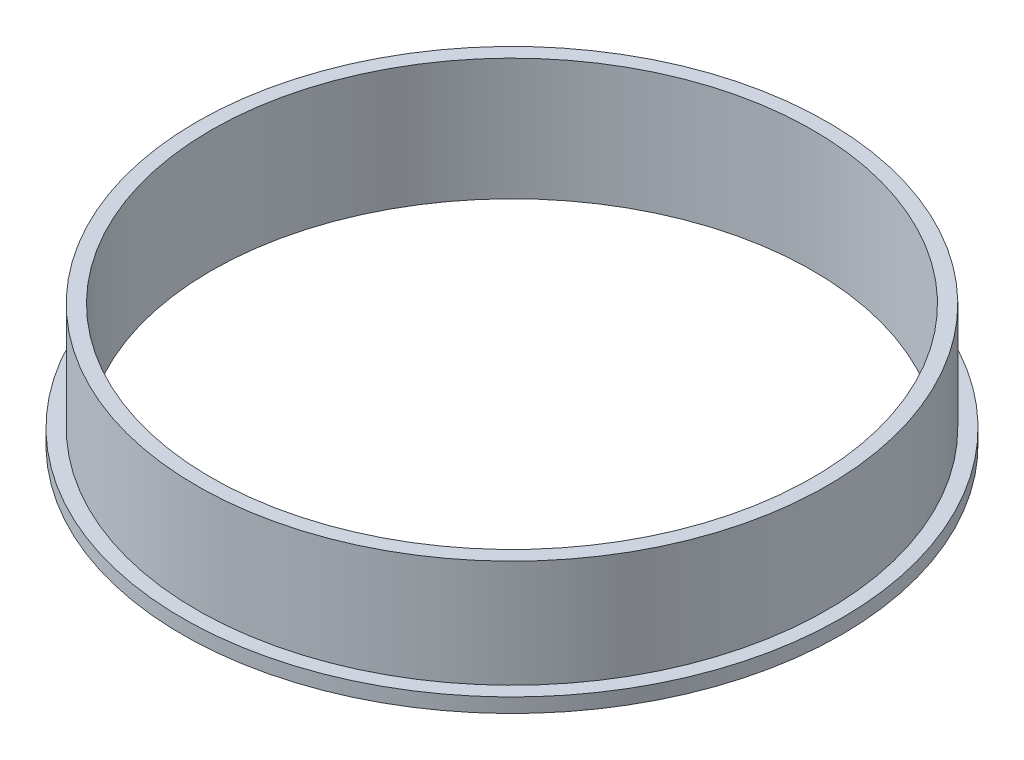
ISO-10303-21;
HEADER;
FILE_DESCRIPTION(('STEP AP214'),'2;1');
FILE_NAME('part.step','',(''),(''),'','','');
FILE_SCHEMA(('AUTOMOTIVE_DESIGN { 1 0 10303 214 1 1 1 1 }'));
ENDSEC;
DATA;
#1=APPLICATION_CONTEXT('core data for automotive mechanical design processes');
#2=APPLICATION_PROTOCOL_DEFINITION('international standard','automotive_design',2000,#1);
#3=PRODUCT_CONTEXT('',#1,'mechanical');
#4=PRODUCT('Part','Part','',(#3));
#5=PRODUCT_RELATED_PRODUCT_CATEGORY('part','',(#4));
#6=PRODUCT_DEFINITION_FORMATION('','',#4);
#7=PRODUCT_DEFINITION_CONTEXT('part definition',#1,'design');
#8=PRODUCT_DEFINITION('design','',#6,#7);
#9=PRODUCT_DEFINITION_SHAPE('','',#8);
#10=(LENGTH_UNIT() NAMED_UNIT(*) SI_UNIT(.MILLI.,.METRE.));
#11=(NAMED_UNIT(*) PLANE_ANGLE_UNIT() SI_UNIT($,.RADIAN.));
#12=(NAMED_UNIT(*) SI_UNIT($,.STERADIAN.) SOLID_ANGLE_UNIT());
#13=UNCERTAINTY_MEASURE_WITH_UNIT(LENGTH_MEASURE(1.E-05),#10,'distance_accuracy_value','');
#14=(GEOMETRIC_REPRESENTATION_CONTEXT(3) GLOBAL_UNCERTAINTY_ASSIGNED_CONTEXT((#13)) GLOBAL_UNIT_ASSIGNED_CONTEXT((#10,
#11,#12)) REPRESENTATION_CONTEXT('',''));
#15=CARTESIAN_POINT('',(0.,0.,0.));
#16=DIRECTION('',(0.,0.,1.));
#17=DIRECTION('',(1.,0.,0.));
#18=AXIS2_PLACEMENT_3D('',#15,#16,#17);
#19=CARTESIAN_POINT('',(0.,15.8556149732621,0.));
#20=DIRECTION('',(0.,1.,0.));
#21=DIRECTION('',(-1.,0.,0.));
#22=AXIS2_PLACEMENT_3D('',#19,#20,#21);
#23=CYLINDRICAL_SURFACE('',#22,43.9999999999998);
#24=CARTESIAN_POINT('',(0.,24.,0.));
#25=DIRECTION('',(0.,1.,0.));
#26=DIRECTION('',(-1.,0.,0.));
#27=AXIS2_PLACEMENT_3D('',#24,#25,#26);
#28=CIRCLE('',#27,43.9999999999998);
#29=CARTESIAN_POINT('',(-43.9999999999998,24.,0.));
#30=VERTEX_POINT('',#29);
#31=EDGE_CURVE('E55',#30,#30,#28,.T.);
#32=ORIENTED_EDGE('',*,*,#31,.F.);
#33=EDGE_LOOP('',(#32));
#34=FACE_BOUND('',#33,.T.);
#35=CARTESIAN_POINT('',(0.,8.99999999999998,0.));
#36=DIRECTION('',(0.,1.,0.));
#37=DIRECTION('',(-1.,0.,0.));
#38=AXIS2_PLACEMENT_3D('',#35,#36,#37);
#39=CIRCLE('',#38,43.9999999999998);
#40=CARTESIAN_POINT('',(-43.9999999999998,8.99999999999998,0.));
#41=VERTEX_POINT('',#40);
#42=EDGE_CURVE('E10',#41,#41,#39,.T.);
#43=ORIENTED_EDGE('',*,*,#42,.T.);
#44=EDGE_LOOP('',(#43));
#45=FACE_BOUND('',#44,.T.);
#46=ADVANCED_FACE('F33',(#34,#45),#23,.T.);
#47=CARTESIAN_POINT('',(0.,8.99999999999998,0.));
#48=DIRECTION('',(0.,-1.,0.));
#49=DIRECTION('',(1.,0.,0.));
#50=AXIS2_PLACEMENT_3D('',#47,#48,#49);
#51=PLANE('',#50);
#52=ORIENTED_EDGE('',*,*,#42,.F.);
#53=EDGE_LOOP('',(#52));
#54=FACE_BOUND('',#53,.T.);
#55=CARTESIAN_POINT('',(0.,8.99999999999998,0.));
#56=DIRECTION('',(0.,1.,0.));
#57=DIRECTION('',(-1.,0.,0.));
#58=AXIS2_PLACEMENT_3D('',#55,#56,#57);
#59=CIRCLE('',#58,46.);
#60=CARTESIAN_POINT('',(-46.,8.99999999999998,0.));
#61=VERTEX_POINT('',#60);
#62=EDGE_CURVE('E39',#61,#61,#59,.T.);
#63=ORIENTED_EDGE('',*,*,#62,.T.);
#64=EDGE_LOOP('',(#63));
#65=FACE_BOUND('',#64,.T.);
#66=ADVANCED_FACE('F62',(#54,#65),#51,.F.);
#67=CARTESIAN_POINT('',(0.,15.8556149732621,0.));
#68=DIRECTION('',(0.,1.,0.));
#69=DIRECTION('',(-1.,0.,0.));
#70=AXIS2_PLACEMENT_3D('',#67,#68,#69);
#71=CYLINDRICAL_SURFACE('',#70,46.);
#72=ORIENTED_EDGE('',*,*,#62,.F.);
#73=EDGE_LOOP('',(#72));
#74=FACE_BOUND('',#73,.T.);
#75=CARTESIAN_POINT('',(0.,6.99999999999998,0.));
#76=DIRECTION('',(0.,1.,0.));
#77=DIRECTION('',(-1.,0.,0.));
#78=AXIS2_PLACEMENT_3D('',#75,#76,#77);
#79=CIRCLE('',#78,46.);
#80=CARTESIAN_POINT('',(-46.,6.99999999999998,0.));
#81=VERTEX_POINT('',#80);
#82=EDGE_CURVE('E43',#81,#81,#79,.T.);
#83=ORIENTED_EDGE('',*,*,#82,.T.);
#84=EDGE_LOOP('',(#83));
#85=FACE_BOUND('',#84,.T.);
#86=ADVANCED_FACE('F66',(#74,#85),#71,.T.);
#87=CARTESIAN_POINT('',(0.,6.99999999999998,0.));
#88=DIRECTION('',(0.,1.,0.));
#89=DIRECTION('',(-1.,0.,0.));
#90=AXIS2_PLACEMENT_3D('',#87,#88,#89);
#91=PLANE('',#90);
#92=ORIENTED_EDGE('',*,*,#82,.F.);
#93=EDGE_LOOP('',(#92));
#94=FACE_BOUND('',#93,.T.);
#95=CARTESIAN_POINT('',(0.,6.99999999999998,0.));
#96=DIRECTION('',(0.,1.,0.));
#97=DIRECTION('',(-1.,0.,0.));
#98=AXIS2_PLACEMENT_3D('',#95,#96,#97);
#99=CIRCLE('',#98,42.);
#100=CARTESIAN_POINT('',(-42.,6.99999999999998,0.));
#101=VERTEX_POINT('',#100);
#102=EDGE_CURVE('E47',#101,#101,#99,.T.);
#103=ORIENTED_EDGE('',*,*,#102,.T.);
#104=EDGE_LOOP('',(#103));
#105=FACE_BOUND('',#104,.T.);
#106=ADVANCED_FACE('F71',(#94,#105),#91,.F.);
#107=CARTESIAN_POINT('',(0.,15.8556149732621,0.));
#108=DIRECTION('',(0.,1.,0.));
#109=DIRECTION('',(-1.,0.,0.));
#110=AXIS2_PLACEMENT_3D('',#107,#108,#109);
#111=CYLINDRICAL_SURFACE('',#110,42.);
#112=ORIENTED_EDGE('',*,*,#102,.F.);
#113=EDGE_LOOP('',(#112));
#114=FACE_BOUND('',#113,.T.);
#115=CARTESIAN_POINT('',(0.,24.,0.));
#116=DIRECTION('',(0.,1.,0.));
#117=DIRECTION('',(-1.,0.,0.));
#118=AXIS2_PLACEMENT_3D('',#115,#116,#117);
#119=CIRCLE('',#118,42.);
#120=CARTESIAN_POINT('',(-42.,24.,0.));
#121=VERTEX_POINT('',#120);
#122=EDGE_CURVE('E52',#121,#121,#119,.T.);
#123=ORIENTED_EDGE('',*,*,#122,.T.);
#124=EDGE_LOOP('',(#123));
#125=FACE_BOUND('',#124,.T.);
#126=ADVANCED_FACE('F77',(#114,#125),#111,.F.);
#127=CARTESIAN_POINT('',(0.,24.,0.));
#128=DIRECTION('',(0.,-1.,0.));
#129=DIRECTION('',(1.,0.,0.));
#130=AXIS2_PLACEMENT_3D('',#127,#128,#129);
#131=PLANE('',#130);
#132=ORIENTED_EDGE('',*,*,#122,.F.);
#133=EDGE_LOOP('',(#132));
#134=FACE_BOUND('',#133,.T.);
#135=ORIENTED_EDGE('',*,*,#31,.T.);
#136=EDGE_LOOP('',(#135));
#137=FACE_BOUND('',#136,.T.);
#138=ADVANCED_FACE('F59',(#134,#137),#131,.F.);
#139=CLOSED_SHELL('',(#46,#66,#86,#106,#126,#138));
#140=MANIFOLD_SOLID_BREP('B2',#139);
#141=ADVANCED_BREP_SHAPE_REPRESENTATION('',(#18,#140),#14);
#142=SHAPE_DEFINITION_REPRESENTATION(#9,#141);
ENDSEC;
END-ISO-10303-21;
